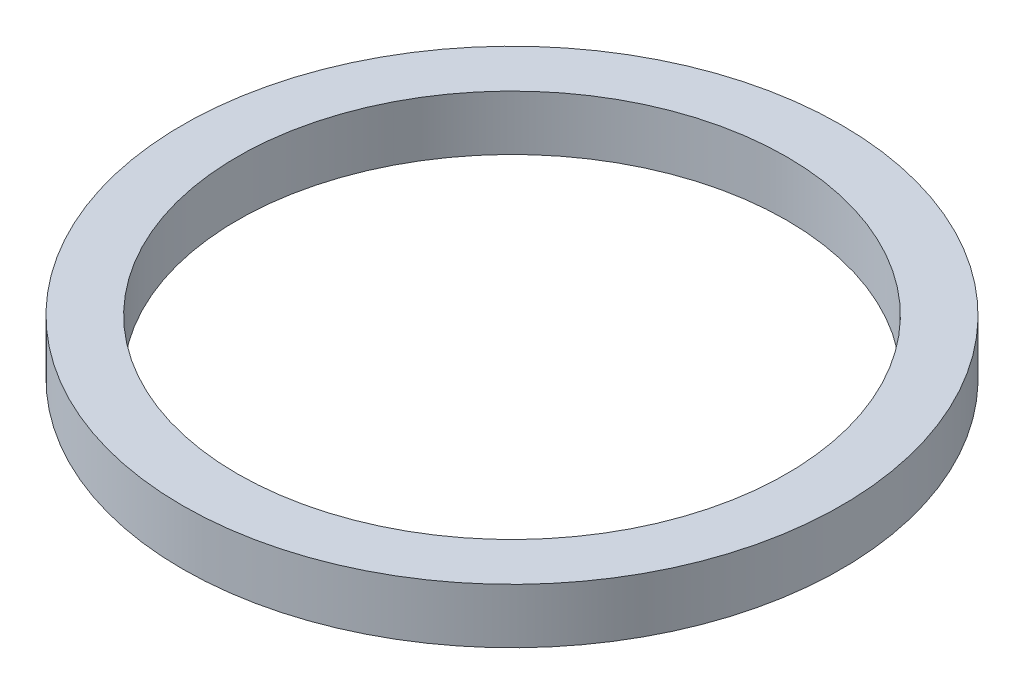
ISO-10303-21;
HEADER;
FILE_DESCRIPTION(('STEP AP214'),'2;1');
FILE_NAME('part.step','',(''),(''),'','','');
FILE_SCHEMA(('AUTOMOTIVE_DESIGN { 1 0 10303 214 1 1 1 1 }'));
ENDSEC;
DATA;
#1=APPLICATION_CONTEXT('core data for automotive mechanical design processes');
#2=APPLICATION_PROTOCOL_DEFINITION('international standard','automotive_design',2000,#1);
#3=PRODUCT_CONTEXT('',#1,'mechanical');
#4=PRODUCT('Part','Part','',(#3));
#5=PRODUCT_RELATED_PRODUCT_CATEGORY('part','',(#4));
#6=PRODUCT_DEFINITION_FORMATION('','',#4);
#7=PRODUCT_DEFINITION_CONTEXT('part definition',#1,'design');
#8=PRODUCT_DEFINITION('design','',#6,#7);
#9=PRODUCT_DEFINITION_SHAPE('','',#8);
#10=(LENGTH_UNIT() NAMED_UNIT(*) SI_UNIT(.MILLI.,.METRE.));
#11=(NAMED_UNIT(*) PLANE_ANGLE_UNIT() SI_UNIT($,.RADIAN.));
#12=(NAMED_UNIT(*) SI_UNIT($,.STERADIAN.) SOLID_ANGLE_UNIT());
#13=UNCERTAINTY_MEASURE_WITH_UNIT(LENGTH_MEASURE(1.E-05),#10,'distance_accuracy_value','');
#14=(GEOMETRIC_REPRESENTATION_CONTEXT(3) GLOBAL_UNCERTAINTY_ASSIGNED_CONTEXT((#13)) GLOBAL_UNIT_ASSIGNED_CONTEXT((#10,
#11,#12)) REPRESENTATION_CONTEXT('',''));
#15=CARTESIAN_POINT('',(0.,0.,0.));
#16=DIRECTION('',(0.,0.,1.));
#17=DIRECTION('',(1.,0.,0.));
#18=AXIS2_PLACEMENT_3D('',#15,#16,#17);
#19=CARTESIAN_POINT('',(0.,6.,0.));
#20=DIRECTION('',(0.,1.,0.));
#21=DIRECTION('',(0.,0.,1.));
#22=AXIS2_PLACEMENT_3D('',#19,#20,#21);
#23=PLANE('',#22);
#24=CARTESIAN_POINT('',(0.,6.,0.));
#25=DIRECTION('',(0.,1.,0.));
#26=DIRECTION('',(0.,0.,1.));
#27=AXIS2_PLACEMENT_3D('',#24,#25,#26);
#28=CIRCLE('',#27,36.);
#29=CARTESIAN_POINT('',(0.,6.,36.));
#30=VERTEX_POINT('',#29);
#31=EDGE_CURVE('E11',#30,#30,#28,.T.);
#32=ORIENTED_EDGE('',*,*,#31,.T.);
#33=EDGE_LOOP('',(#32));
#34=FACE_BOUND('',#33,.T.);
#35=CARTESIAN_POINT('',(0.,6.,0.));
#36=DIRECTION('',(0.,1.,0.));
#37=DIRECTION('',(0.,0.,1.));
#38=AXIS2_PLACEMENT_3D('',#35,#36,#37);
#39=CIRCLE('',#38,30.);
#40=CARTESIAN_POINT('',(0.,6.,30.));
#41=VERTEX_POINT('',#40);
#42=EDGE_CURVE('E56',#41,#41,#39,.T.);
#43=ORIENTED_EDGE('',*,*,#42,.F.);
#44=EDGE_LOOP('',(#43));
#45=FACE_BOUND('',#44,.T.);
#46=ADVANCED_FACE('F43',(#34,#45),#23,.T.);
#47=CARTESIAN_POINT('',(0.,0.,0.));
#48=DIRECTION('',(0.,1.,0.));
#49=DIRECTION('',(0.,0.,1.));
#50=AXIS2_PLACEMENT_3D('',#47,#48,#49);
#51=PLANE('',#50);
#52=CARTESIAN_POINT('',(0.,0.,0.));
#53=DIRECTION('',(0.,1.,0.));
#54=DIRECTION('',(0.,0.,1.));
#55=AXIS2_PLACEMENT_3D('',#52,#53,#54);
#56=CIRCLE('',#55,36.);
#57=CARTESIAN_POINT('',(0.,0.,36.));
#58=VERTEX_POINT('',#57);
#59=EDGE_CURVE('E47',#58,#58,#56,.T.);
#60=ORIENTED_EDGE('',*,*,#59,.F.);
#61=EDGE_LOOP('',(#60));
#62=FACE_BOUND('',#61,.T.);
#63=CARTESIAN_POINT('',(0.,0.,0.));
#64=DIRECTION('',(0.,1.,0.));
#65=DIRECTION('',(0.,0.,1.));
#66=AXIS2_PLACEMENT_3D('',#63,#64,#65);
#67=CIRCLE('',#66,30.);
#68=CARTESIAN_POINT('',(0.,0.,30.));
#69=VERTEX_POINT('',#68);
#70=EDGE_CURVE('E58',#69,#69,#67,.T.);
#71=ORIENTED_EDGE('',*,*,#70,.T.);
#72=EDGE_LOOP('',(#71));
#73=FACE_BOUND('',#72,.T.);
#74=ADVANCED_FACE('F70',(#62,#73),#51,.F.);
#75=CARTESIAN_POINT('',(0.,6.,0.));
#76=DIRECTION('',(0.,-1.,0.));
#77=DIRECTION('',(0.,0.,-1.));
#78=AXIS2_PLACEMENT_3D('',#75,#76,#77);
#79=CYLINDRICAL_SURFACE('',#78,36.);
#80=ORIENTED_EDGE('',*,*,#31,.F.);
#81=EDGE_LOOP('',(#80));
#82=FACE_BOUND('',#81,.T.);
#83=ORIENTED_EDGE('',*,*,#59,.T.);
#84=EDGE_LOOP('',(#83));
#85=FACE_BOUND('',#84,.T.);
#86=ADVANCED_FACE('F45',(#82,#85),#79,.T.);
#87=CARTESIAN_POINT('',(0.,6.,0.));
#88=DIRECTION('',(0.,-1.,0.));
#89=DIRECTION('',(0.,0.,-1.));
#90=AXIS2_PLACEMENT_3D('',#87,#88,#89);
#91=CYLINDRICAL_SURFACE('',#90,30.);
#92=ORIENTED_EDGE('',*,*,#42,.T.);
#93=EDGE_LOOP('',(#92));
#94=FACE_BOUND('',#93,.T.);
#95=ORIENTED_EDGE('',*,*,#70,.F.);
#96=EDGE_LOOP('',(#95));
#97=FACE_BOUND('',#96,.T.);
#98=ADVANCED_FACE('F66',(#94,#97),#91,.F.);
#99=CLOSED_SHELL('',(#46,#74,#86,#98));
#100=MANIFOLD_SOLID_BREP('B2',#99);
#101=ADVANCED_BREP_SHAPE_REPRESENTATION('',(#18,#100),#14);
#102=SHAPE_DEFINITION_REPRESENTATION(#9,#101);
ENDSEC;
END-ISO-10303-21;
